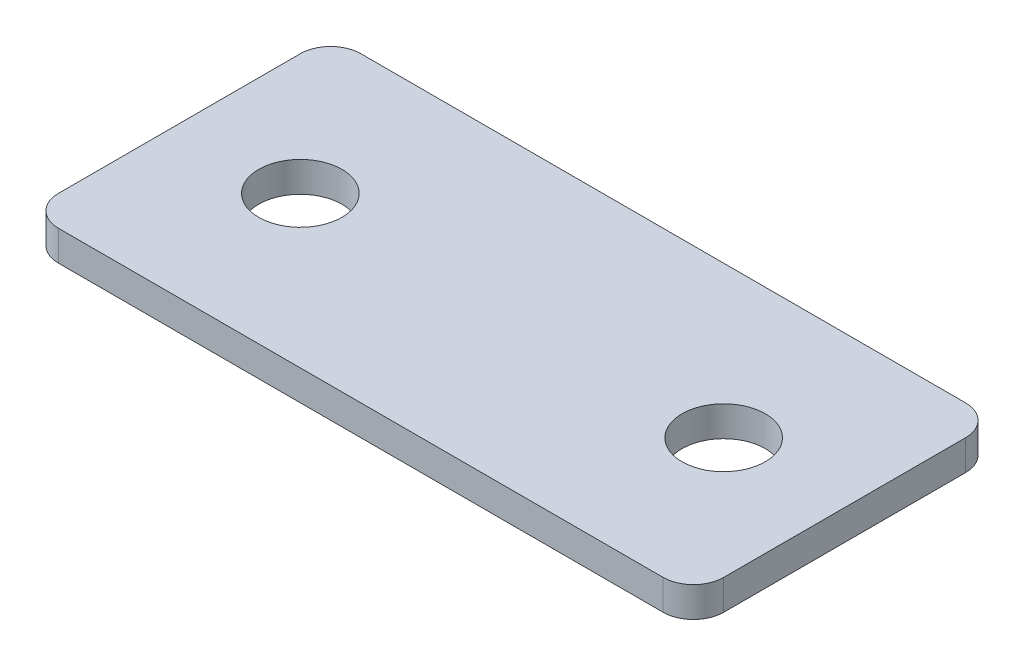
ISO-10303-21;
HEADER;
FILE_DESCRIPTION(('STEP AP214'),'2;1');
FILE_NAME('part.step','',(''),(''),'','','');
FILE_SCHEMA(('AUTOMOTIVE_DESIGN { 1 0 10303 214 1 1 1 1 }'));
ENDSEC;
DATA;
#1=APPLICATION_CONTEXT('core data for automotive mechanical design processes');
#2=APPLICATION_PROTOCOL_DEFINITION('international standard','automotive_design',2000,#1);
#3=PRODUCT_CONTEXT('',#1,'mechanical');
#4=PRODUCT('Part','Part','',(#3));
#5=PRODUCT_RELATED_PRODUCT_CATEGORY('part','',(#4));
#6=PRODUCT_DEFINITION_FORMATION('','',#4);
#7=PRODUCT_DEFINITION_CONTEXT('part definition',#1,'design');
#8=PRODUCT_DEFINITION('design','',#6,#7);
#9=PRODUCT_DEFINITION_SHAPE('','',#8);
#10=(LENGTH_UNIT() NAMED_UNIT(*) SI_UNIT(.MILLI.,.METRE.));
#11=(NAMED_UNIT(*) PLANE_ANGLE_UNIT() SI_UNIT($,.RADIAN.));
#12=(NAMED_UNIT(*) SI_UNIT($,.STERADIAN.) SOLID_ANGLE_UNIT());
#13=UNCERTAINTY_MEASURE_WITH_UNIT(LENGTH_MEASURE(1.E-05),#10,'distance_accuracy_value','');
#14=(GEOMETRIC_REPRESENTATION_CONTEXT(3) GLOBAL_UNCERTAINTY_ASSIGNED_CONTEXT((#13)) GLOBAL_UNIT_ASSIGNED_CONTEXT((#10,
#11,#12)) REPRESENTATION_CONTEXT('',''));
#15=CARTESIAN_POINT('',(0.,0.,0.));
#16=DIRECTION('',(0.,0.,1.));
#17=DIRECTION('',(1.,0.,0.));
#18=AXIS2_PLACEMENT_3D('',#15,#16,#17);
#19=CARTESIAN_POINT('',(0.,3.175,0.));
#20=DIRECTION('',(0.,-1.,0.));
#21=DIRECTION('',(0.,0.,-1.));
#22=AXIS2_PLACEMENT_3D('',#19,#20,#21);
#23=PLANE('',#22);
#24=DIRECTION('',(-1.,0.,0.));
#25=VECTOR('',#24,1.);
#26=CARTESIAN_POINT('',(0.,3.175,-31.75));
#27=LINE('',#26,#25);
#28=CARTESIAN_POINT('',(66.675,3.175,-31.75));
#29=VERTEX_POINT('',#28);
#30=CARTESIAN_POINT('',(3.175,3.175,-31.75));
#31=VERTEX_POINT('',#30);
#32=EDGE_CURVE('E135',#29,#31,#27,.T.);
#33=ORIENTED_EDGE('',*,*,#32,.T.);
#34=CARTESIAN_POINT('',(3.175,3.175,-28.575));
#35=DIRECTION('',(0.,-1.,0.));
#36=DIRECTION('',(0.,0.,-1.));
#37=AXIS2_PLACEMENT_3D('',#34,#35,#36);
#38=CIRCLE('',#37,3.175);
#39=CARTESIAN_POINT('',(0.,3.175,-28.575));
#40=VERTEX_POINT('',#39);
#41=EDGE_CURVE('E154',#31,#40,#38,.F.);
#42=ORIENTED_EDGE('',*,*,#41,.T.);
#43=DIRECTION('',(0.,0.,1.));
#44=VECTOR('',#43,1.);
#45=CARTESIAN_POINT('',(0.,3.175,0.));
#46=LINE('',#45,#44);
#47=CARTESIAN_POINT('',(0.,3.175,-3.175));
#48=VERTEX_POINT('',#47);
#49=EDGE_CURVE('E118',#40,#48,#46,.T.);
#50=ORIENTED_EDGE('',*,*,#49,.T.);
#51=CARTESIAN_POINT('',(3.175,3.175,-3.175));
#52=DIRECTION('',(0.,-1.,0.));
#53=DIRECTION('',(0.,0.,-1.));
#54=AXIS2_PLACEMENT_3D('',#51,#52,#53);
#55=CIRCLE('',#54,3.175);
#56=CARTESIAN_POINT('',(3.175,3.175,0.));
#57=VERTEX_POINT('',#56);
#58=EDGE_CURVE('E152',#48,#57,#55,.F.);
#59=ORIENTED_EDGE('',*,*,#58,.T.);
#60=DIRECTION('',(1.,0.,0.));
#61=VECTOR('',#60,1.);
#62=CARTESIAN_POINT('',(0.,3.175,0.));
#63=LINE('',#62,#61);
#64=CARTESIAN_POINT('',(66.675,3.175,0.));
#65=VERTEX_POINT('',#64);
#66=EDGE_CURVE('E174',#57,#65,#63,.T.);
#67=ORIENTED_EDGE('',*,*,#66,.T.);
#68=CARTESIAN_POINT('',(66.675,3.175,-3.175));
#69=DIRECTION('',(0.,-1.,0.));
#70=DIRECTION('',(0.,0.,-1.));
#71=AXIS2_PLACEMENT_3D('',#68,#69,#70);
#72=CIRCLE('',#71,3.175);
#73=CARTESIAN_POINT('',(69.85,3.175,-3.175));
#74=VERTEX_POINT('',#73);
#75=EDGE_CURVE('E53',#65,#74,#72,.F.);
#76=ORIENTED_EDGE('',*,*,#75,.T.);
#77=DIRECTION('',(0.,0.,-1.));
#78=VECTOR('',#77,1.);
#79=CARTESIAN_POINT('',(69.85,3.175,0.));
#80=LINE('',#79,#78);
#81=CARTESIAN_POINT('',(69.85,3.175,-28.575));
#82=VERTEX_POINT('',#81);
#83=EDGE_CURVE('E164',#74,#82,#80,.T.);
#84=ORIENTED_EDGE('',*,*,#83,.T.);
#85=CARTESIAN_POINT('',(66.675,3.175,-28.575));
#86=DIRECTION('',(0.,-1.,0.));
#87=DIRECTION('',(0.,0.,-1.));
#88=AXIS2_PLACEMENT_3D('',#85,#86,#87);
#89=CIRCLE('',#88,3.175);
#90=EDGE_CURVE('E150',#82,#29,#89,.F.);
#91=ORIENTED_EDGE('',*,*,#90,.T.);
#92=EDGE_LOOP('',(#33,#42,#50,#59,#67,#76,#84,#91));
#93=FACE_BOUND('',#92,.T.);
#94=CARTESIAN_POINT('',(12.7,3.175,-15.875));
#95=DIRECTION('',(0.,1.,0.));
#96=DIRECTION('',(0.,0.,1.));
#97=AXIS2_PLACEMENT_3D('',#94,#95,#96);
#98=CIRCLE('',#97,4.3688);
#99=CARTESIAN_POINT('',(12.7,3.175,-11.5062));
#100=VERTEX_POINT('',#99);
#101=EDGE_CURVE('E126',#100,#100,#98,.T.);
#102=ORIENTED_EDGE('',*,*,#101,.F.);
#103=EDGE_LOOP('',(#102));
#104=FACE_BOUND('',#103,.T.);
#105=CARTESIAN_POINT('',(57.15,3.175,-15.875));
#106=DIRECTION('',(0.,1.,0.));
#107=DIRECTION('',(0.,0.,1.));
#108=AXIS2_PLACEMENT_3D('',#105,#106,#107);
#109=CIRCLE('',#108,4.3688);
#110=CARTESIAN_POINT('',(57.15,3.175,-11.5062));
#111=VERTEX_POINT('',#110);
#112=EDGE_CURVE('E179',#111,#111,#109,.T.);
#113=ORIENTED_EDGE('',*,*,#112,.F.);
#114=EDGE_LOOP('',(#113));
#115=FACE_BOUND('',#114,.T.);
#116=ADVANCED_FACE('F33',(#93,#104,#115),#23,.F.);
#117=CARTESIAN_POINT('',(0.,0.,0.));
#118=DIRECTION('',(0.,-1.,0.));
#119=DIRECTION('',(0.,0.,-1.));
#120=AXIS2_PLACEMENT_3D('',#117,#118,#119);
#121=PLANE('',#120);
#122=CARTESIAN_POINT('',(12.7,0.,-15.875));
#123=DIRECTION('',(0.,1.,0.));
#124=DIRECTION('',(0.,0.,1.));
#125=AXIS2_PLACEMENT_3D('',#122,#123,#124);
#126=CIRCLE('',#125,4.3688);
#127=CARTESIAN_POINT('',(12.7,0.,-11.5062));
#128=VERTEX_POINT('',#127);
#129=EDGE_CURVE('E132',#128,#128,#126,.T.);
#130=ORIENTED_EDGE('',*,*,#129,.T.);
#131=EDGE_LOOP('',(#130));
#132=FACE_BOUND('',#131,.T.);
#133=DIRECTION('',(0.,0.,1.));
#134=VECTOR('',#133,1.);
#135=CARTESIAN_POINT('',(0.,0.,0.));
#136=LINE('',#135,#134);
#137=CARTESIAN_POINT('',(0.,0.,-28.575));
#138=VERTEX_POINT('',#137);
#139=CARTESIAN_POINT('',(0.,0.,-3.175));
#140=VERTEX_POINT('',#139);
#141=EDGE_CURVE('E115',#138,#140,#136,.T.);
#142=ORIENTED_EDGE('',*,*,#141,.F.);
#143=CARTESIAN_POINT('',(3.175,0.,-28.575));
#144=DIRECTION('',(0.,-1.,0.));
#145=DIRECTION('',(0.,0.,-1.));
#146=AXIS2_PLACEMENT_3D('',#143,#144,#145);
#147=CIRCLE('',#146,3.175);
#148=CARTESIAN_POINT('',(3.175,0.,-31.75));
#149=VERTEX_POINT('',#148);
#150=EDGE_CURVE('E98',#138,#149,#147,.T.);
#151=ORIENTED_EDGE('',*,*,#150,.T.);
#152=DIRECTION('',(-1.,0.,0.));
#153=VECTOR('',#152,1.);
#154=CARTESIAN_POINT('',(0.,0.,-31.75));
#155=LINE('',#154,#153);
#156=CARTESIAN_POINT('',(66.675,0.,-31.75));
#157=VERTEX_POINT('',#156);
#158=EDGE_CURVE('E139',#157,#149,#155,.T.);
#159=ORIENTED_EDGE('',*,*,#158,.F.);
#160=CARTESIAN_POINT('',(66.675,0.,-28.575));
#161=DIRECTION('',(0.,-1.,0.));
#162=DIRECTION('',(0.,0.,-1.));
#163=AXIS2_PLACEMENT_3D('',#160,#161,#162);
#164=CIRCLE('',#163,3.175);
#165=CARTESIAN_POINT('',(69.85,0.,-28.575));
#166=VERTEX_POINT('',#165);
#167=EDGE_CURVE('E143',#157,#166,#164,.T.);
#168=ORIENTED_EDGE('',*,*,#167,.T.);
#169=DIRECTION('',(0.,0.,-1.));
#170=VECTOR('',#169,1.);
#171=CARTESIAN_POINT('',(69.85,0.,0.));
#172=LINE('',#171,#170);
#173=CARTESIAN_POINT('',(69.85,0.,-3.175));
#174=VERTEX_POINT('',#173);
#175=EDGE_CURVE('E129',#174,#166,#172,.T.);
#176=ORIENTED_EDGE('',*,*,#175,.F.);
#177=CARTESIAN_POINT('',(66.675,0.,-3.175));
#178=DIRECTION('',(0.,-1.,0.));
#179=DIRECTION('',(0.,0.,-1.));
#180=AXIS2_PLACEMENT_3D('',#177,#178,#179);
#181=CIRCLE('',#180,3.175);
#182=CARTESIAN_POINT('',(66.675,0.,0.));
#183=VERTEX_POINT('',#182);
#184=EDGE_CURVE('E119',#174,#183,#181,.T.);
#185=ORIENTED_EDGE('',*,*,#184,.T.);
#186=DIRECTION('',(1.,0.,0.));
#187=VECTOR('',#186,1.);
#188=CARTESIAN_POINT('',(0.,0.,0.));
#189=LINE('',#188,#187);
#190=CARTESIAN_POINT('',(3.175,0.,0.));
#191=VERTEX_POINT('',#190);
#192=EDGE_CURVE('E125',#191,#183,#189,.T.);
#193=ORIENTED_EDGE('',*,*,#192,.F.);
#194=CARTESIAN_POINT('',(3.175,0.,-3.175));
#195=DIRECTION('',(0.,-1.,0.));
#196=DIRECTION('',(0.,0.,-1.));
#197=AXIS2_PLACEMENT_3D('',#194,#195,#196);
#198=CIRCLE('',#197,3.175);
#199=EDGE_CURVE('E109',#191,#140,#198,.T.);
#200=ORIENTED_EDGE('',*,*,#199,.T.);
#201=EDGE_LOOP('',(#142,#151,#159,#168,#176,#185,#193,#200));
#202=FACE_BOUND('',#201,.T.);
#203=CARTESIAN_POINT('',(57.15,0.,-15.875));
#204=DIRECTION('',(0.,1.,0.));
#205=DIRECTION('',(0.,0.,1.));
#206=AXIS2_PLACEMENT_3D('',#203,#204,#205);
#207=CIRCLE('',#206,4.3688);
#208=CARTESIAN_POINT('',(57.15,0.,-11.5062));
#209=VERTEX_POINT('',#208);
#210=EDGE_CURVE('E181',#209,#209,#207,.T.);
#211=ORIENTED_EDGE('',*,*,#210,.T.);
#212=EDGE_LOOP('',(#211));
#213=FACE_BOUND('',#212,.T.);
#214=ADVANCED_FACE('F122',(#132,#202,#213),#121,.T.);
#215=CARTESIAN_POINT('',(0.,3.175,0.));
#216=DIRECTION('',(1.,0.,0.));
#217=DIRECTION('',(0.,0.,-1.));
#218=AXIS2_PLACEMENT_3D('',#215,#216,#217);
#219=PLANE('',#218);
#220=ORIENTED_EDGE('',*,*,#49,.F.);
#221=DIRECTION('',(0.,-1.,0.));
#222=VECTOR('',#221,1.);
#223=CARTESIAN_POINT('',(0.,3.175,-28.575));
#224=LINE('',#223,#222);
#225=EDGE_CURVE('E102',#40,#138,#224,.T.);
#226=ORIENTED_EDGE('',*,*,#225,.T.);
#227=ORIENTED_EDGE('',*,*,#141,.T.);
#228=DIRECTION('',(0.,-1.,0.));
#229=VECTOR('',#228,1.);
#230=CARTESIAN_POINT('',(0.,3.175,-3.175));
#231=LINE('',#230,#229);
#232=EDGE_CURVE('E120',#140,#48,#231,.F.);
#233=ORIENTED_EDGE('',*,*,#232,.T.);
#234=EDGE_LOOP('',(#220,#226,#227,#233));
#235=FACE_BOUND('',#234,.T.);
#236=ADVANCED_FACE('F114',(#235),#219,.F.);
#237=CARTESIAN_POINT('',(0.,3.175,0.));
#238=DIRECTION('',(0.,0.,-1.));
#239=DIRECTION('',(-1.,0.,0.));
#240=AXIS2_PLACEMENT_3D('',#237,#238,#239);
#241=PLANE('',#240);
#242=ORIENTED_EDGE('',*,*,#66,.F.);
#243=DIRECTION('',(0.,-1.,0.));
#244=VECTOR('',#243,1.);
#245=CARTESIAN_POINT('',(3.175,3.175,0.));
#246=LINE('',#245,#244);
#247=EDGE_CURVE('E158',#57,#191,#246,.T.);
#248=ORIENTED_EDGE('',*,*,#247,.T.);
#249=ORIENTED_EDGE('',*,*,#192,.T.);
#250=DIRECTION('',(0.,-1.,0.));
#251=VECTOR('',#250,1.);
#252=CARTESIAN_POINT('',(66.675,3.175,0.));
#253=LINE('',#252,#251);
#254=EDGE_CURVE('E156',#183,#65,#253,.F.);
#255=ORIENTED_EDGE('',*,*,#254,.T.);
#256=EDGE_LOOP('',(#242,#248,#249,#255));
#257=FACE_BOUND('',#256,.T.);
#258=ADVANCED_FACE('F206',(#257),#241,.F.);
#259=CARTESIAN_POINT('',(69.85,3.175,0.));
#260=DIRECTION('',(-1.,0.,0.));
#261=DIRECTION('',(0.,0.,1.));
#262=AXIS2_PLACEMENT_3D('',#259,#260,#261);
#263=PLANE('',#262);
#264=ORIENTED_EDGE('',*,*,#175,.T.);
#265=DIRECTION('',(0.,-1.,0.));
#266=VECTOR('',#265,1.);
#267=CARTESIAN_POINT('',(69.85,3.175,-28.575));
#268=LINE('',#267,#266);
#269=EDGE_CURVE('E11',#166,#82,#268,.F.);
#270=ORIENTED_EDGE('',*,*,#269,.T.);
#271=ORIENTED_EDGE('',*,*,#83,.F.);
#272=DIRECTION('',(0.,-1.,0.));
#273=VECTOR('',#272,1.);
#274=CARTESIAN_POINT('',(69.85,3.175,-3.175));
#275=LINE('',#274,#273);
#276=EDGE_CURVE('E41',#74,#174,#275,.T.);
#277=ORIENTED_EDGE('',*,*,#276,.T.);
#278=EDGE_LOOP('',(#264,#270,#271,#277));
#279=FACE_BOUND('',#278,.T.);
#280=ADVANCED_FACE('F163',(#279),#263,.F.);
#281=CARTESIAN_POINT('',(0.,3.175,-31.75));
#282=DIRECTION('',(0.,0.,1.));
#283=DIRECTION('',(1.,0.,0.));
#284=AXIS2_PLACEMENT_3D('',#281,#282,#283);
#285=PLANE('',#284);
#286=ORIENTED_EDGE('',*,*,#158,.T.);
#287=DIRECTION('',(0.,-1.,0.));
#288=VECTOR('',#287,1.);
#289=CARTESIAN_POINT('',(3.175,3.175,-31.75));
#290=LINE('',#289,#288);
#291=EDGE_CURVE('E103',#149,#31,#290,.F.);
#292=ORIENTED_EDGE('',*,*,#291,.T.);
#293=ORIENTED_EDGE('',*,*,#32,.F.);
#294=DIRECTION('',(0.,-1.,0.));
#295=VECTOR('',#294,1.);
#296=CARTESIAN_POINT('',(66.675,3.175,-31.75));
#297=LINE('',#296,#295);
#298=EDGE_CURVE('E108',#29,#157,#297,.T.);
#299=ORIENTED_EDGE('',*,*,#298,.T.);
#300=EDGE_LOOP('',(#286,#292,#293,#299));
#301=FACE_BOUND('',#300,.T.);
#302=ADVANCED_FACE('F172',(#301),#285,.F.);
#303=CARTESIAN_POINT('',(12.7,3.175,-15.875));
#304=DIRECTION('',(0.,-1.,0.));
#305=DIRECTION('',(0.,0.,-1.));
#306=AXIS2_PLACEMENT_3D('',#303,#304,#305);
#307=CYLINDRICAL_SURFACE('',#306,4.3688);
#308=ORIENTED_EDGE('',*,*,#101,.T.);
#309=EDGE_LOOP('',(#308));
#310=FACE_BOUND('',#309,.T.);
#311=ORIENTED_EDGE('',*,*,#129,.F.);
#312=EDGE_LOOP('',(#311));
#313=FACE_BOUND('',#312,.T.);
#314=ADVANCED_FACE('F199',(#310,#313),#307,.F.);
#315=CARTESIAN_POINT('',(57.15,3.175,-15.875));
#316=DIRECTION('',(0.,-1.,0.));
#317=DIRECTION('',(0.,0.,-1.));
#318=AXIS2_PLACEMENT_3D('',#315,#316,#317);
#319=CYLINDRICAL_SURFACE('',#318,4.3688);
#320=ORIENTED_EDGE('',*,*,#112,.T.);
#321=EDGE_LOOP('',(#320));
#322=FACE_BOUND('',#321,.T.);
#323=ORIENTED_EDGE('',*,*,#210,.F.);
#324=EDGE_LOOP('',(#323));
#325=FACE_BOUND('',#324,.T.);
#326=ADVANCED_FACE('F187',(#322,#325),#319,.F.);
#327=CARTESIAN_POINT('',(3.175,3.175,-28.575));
#328=DIRECTION('',(0.,-1.,0.));
#329=DIRECTION('',(0.,0.,-1.));
#330=AXIS2_PLACEMENT_3D('',#327,#328,#329);
#331=CYLINDRICAL_SURFACE('',#330,3.175);
#332=ORIENTED_EDGE('',*,*,#41,.F.);
#333=ORIENTED_EDGE('',*,*,#291,.F.);
#334=ORIENTED_EDGE('',*,*,#150,.F.);
#335=ORIENTED_EDGE('',*,*,#225,.F.);
#336=EDGE_LOOP('',(#332,#333,#334,#335));
#337=FACE_BOUND('',#336,.T.);
#338=ADVANCED_FACE('F101',(#337),#331,.T.);
#339=CARTESIAN_POINT('',(3.175,3.175,-3.175));
#340=DIRECTION('',(0.,-1.,0.));
#341=DIRECTION('',(0.,0.,-1.));
#342=AXIS2_PLACEMENT_3D('',#339,#340,#341);
#343=CYLINDRICAL_SURFACE('',#342,3.175);
#344=ORIENTED_EDGE('',*,*,#58,.F.);
#345=ORIENTED_EDGE('',*,*,#232,.F.);
#346=ORIENTED_EDGE('',*,*,#199,.F.);
#347=ORIENTED_EDGE('',*,*,#247,.F.);
#348=EDGE_LOOP('',(#344,#345,#346,#347));
#349=FACE_BOUND('',#348,.T.);
#350=ADVANCED_FACE('F214',(#349),#343,.T.);
#351=CARTESIAN_POINT('',(66.675,3.175,-28.575));
#352=DIRECTION('',(0.,-1.,0.));
#353=DIRECTION('',(0.,0.,-1.));
#354=AXIS2_PLACEMENT_3D('',#351,#352,#353);
#355=CYLINDRICAL_SURFACE('',#354,3.175);
#356=ORIENTED_EDGE('',*,*,#90,.F.);
#357=ORIENTED_EDGE('',*,*,#269,.F.);
#358=ORIENTED_EDGE('',*,*,#167,.F.);
#359=ORIENTED_EDGE('',*,*,#298,.F.);
#360=EDGE_LOOP('',(#356,#357,#358,#359));
#361=FACE_BOUND('',#360,.T.);
#362=ADVANCED_FACE('F169',(#361),#355,.T.);
#363=CARTESIAN_POINT('',(66.675,3.175,-3.175));
#364=DIRECTION('',(0.,-1.,0.));
#365=DIRECTION('',(0.,0.,-1.));
#366=AXIS2_PLACEMENT_3D('',#363,#364,#365);
#367=CYLINDRICAL_SURFACE('',#366,3.175);
#368=ORIENTED_EDGE('',*,*,#75,.F.);
#369=ORIENTED_EDGE('',*,*,#254,.F.);
#370=ORIENTED_EDGE('',*,*,#184,.F.);
#371=ORIENTED_EDGE('',*,*,#276,.F.);
#372=EDGE_LOOP('',(#368,#369,#370,#371));
#373=FACE_BOUND('',#372,.T.);
#374=ADVANCED_FACE('F35',(#373),#367,.T.);
#375=CLOSED_SHELL('',(#116,#214,#236,#258,#280,#302,#314,#326,#338,#350,#362,#374));
#376=MANIFOLD_SOLID_BREP('B2',#375);
#377=ADVANCED_BREP_SHAPE_REPRESENTATION('',(#18,#376),#14);
#378=SHAPE_DEFINITION_REPRESENTATION(#9,#377);
ENDSEC;
END-ISO-10303-21;
